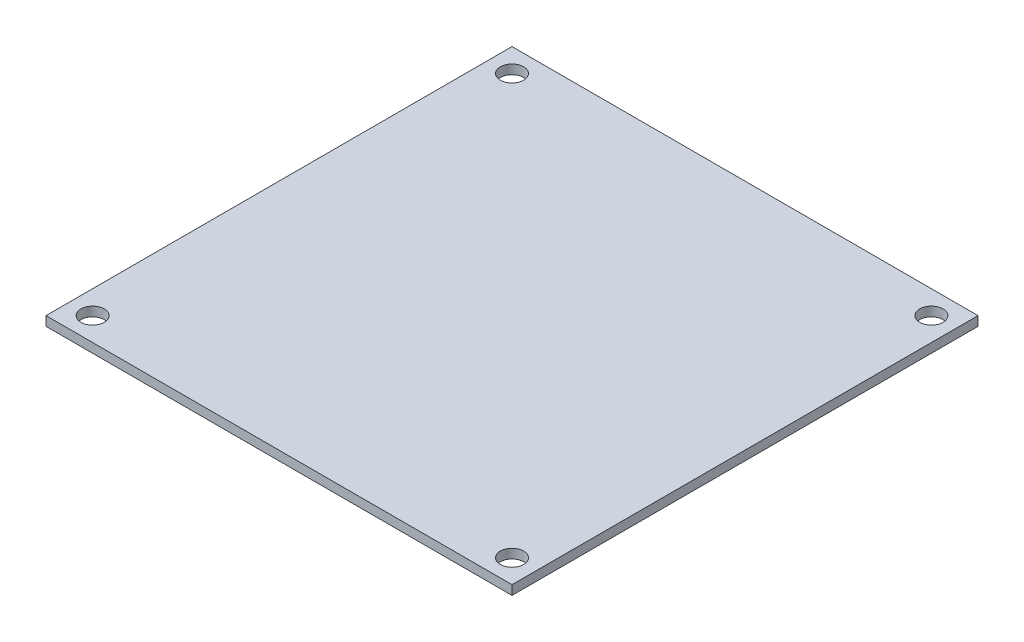
ISO-10303-21;
HEADER;
FILE_DESCRIPTION(('STEP AP214'),'2;1');
FILE_NAME('part.step','',(''),(''),'','','');
FILE_SCHEMA(('AUTOMOTIVE_DESIGN { 1 0 10303 214 1 1 1 1 }'));
ENDSEC;
DATA;
#1=APPLICATION_CONTEXT('core data for automotive mechanical design processes');
#2=APPLICATION_PROTOCOL_DEFINITION('international standard','automotive_design',2000,#1);
#3=PRODUCT_CONTEXT('',#1,'mechanical');
#4=PRODUCT('Part','Part','',(#3));
#5=PRODUCT_RELATED_PRODUCT_CATEGORY('part','',(#4));
#6=PRODUCT_DEFINITION_FORMATION('','',#4);
#7=PRODUCT_DEFINITION_CONTEXT('part definition',#1,'design');
#8=PRODUCT_DEFINITION('design','',#6,#7);
#9=PRODUCT_DEFINITION_SHAPE('','',#8);
#10=(LENGTH_UNIT() NAMED_UNIT(*) SI_UNIT(.MILLI.,.METRE.));
#11=(NAMED_UNIT(*) PLANE_ANGLE_UNIT() SI_UNIT($,.RADIAN.));
#12=(NAMED_UNIT(*) SI_UNIT($,.STERADIAN.) SOLID_ANGLE_UNIT());
#13=UNCERTAINTY_MEASURE_WITH_UNIT(LENGTH_MEASURE(1.E-05),#10,'distance_accuracy_value','');
#14=(GEOMETRIC_REPRESENTATION_CONTEXT(3) GLOBAL_UNCERTAINTY_ASSIGNED_CONTEXT((#13)) GLOBAL_UNIT_ASSIGNED_CONTEXT((#10,
#11,#12)) REPRESENTATION_CONTEXT('',''));
#15=CARTESIAN_POINT('',(0.,0.,0.));
#16=DIRECTION('',(0.,0.,1.));
#17=DIRECTION('',(1.,0.,0.));
#18=AXIS2_PLACEMENT_3D('',#15,#16,#17);
#19=CARTESIAN_POINT('',(-40.,1.6,40.));
#20=DIRECTION('',(0.,1.,0.));
#21=DIRECTION('',(0.,0.,1.));
#22=AXIS2_PLACEMENT_3D('',#19,#20,#21);
#23=PLANE('',#22);
#24=CARTESIAN_POINT('',(36.,1.6,36.));
#25=DIRECTION('',(0.,1.,0.));
#26=DIRECTION('',(0.,0.,1.));
#27=AXIS2_PLACEMENT_3D('',#24,#25,#26);
#28=CIRCLE('',#27,2.);
#29=CARTESIAN_POINT('',(36.,1.6,38.));
#30=VERTEX_POINT('',#29);
#31=EDGE_CURVE('E120',#30,#30,#28,.T.);
#32=ORIENTED_EDGE('',*,*,#31,.F.);
#33=EDGE_LOOP('',(#32));
#34=FACE_BOUND('',#33,.T.);
#35=CARTESIAN_POINT('',(-36.,1.6,-36.));
#36=DIRECTION('',(0.,1.,0.));
#37=DIRECTION('',(0.,0.,1.));
#38=AXIS2_PLACEMENT_3D('',#35,#36,#37);
#39=CIRCLE('',#38,2.);
#40=CARTESIAN_POINT('',(-36.,1.6,-34.));
#41=VERTEX_POINT('',#40);
#42=EDGE_CURVE('E99',#41,#41,#39,.T.);
#43=ORIENTED_EDGE('',*,*,#42,.F.);
#44=EDGE_LOOP('',(#43));
#45=FACE_BOUND('',#44,.T.);
#46=DIRECTION('',(0.,0.,1.));
#47=VECTOR('',#46,1.);
#48=CARTESIAN_POINT('',(-40.,1.6,-40.));
#49=LINE('',#48,#47);
#50=CARTESIAN_POINT('',(-40.,1.6,-40.));
#51=VERTEX_POINT('',#50);
#52=CARTESIAN_POINT('',(-40.,1.6,40.));
#53=VERTEX_POINT('',#52);
#54=EDGE_CURVE('E84',#51,#53,#49,.T.);
#55=ORIENTED_EDGE('',*,*,#54,.T.);
#56=DIRECTION('',(1.,0.,0.));
#57=VECTOR('',#56,1.);
#58=CARTESIAN_POINT('',(-40.,1.6,40.));
#59=LINE('',#58,#57);
#60=CARTESIAN_POINT('',(40.,1.6,40.));
#61=VERTEX_POINT('',#60);
#62=EDGE_CURVE('E79',#53,#61,#59,.T.);
#63=ORIENTED_EDGE('',*,*,#62,.T.);
#64=DIRECTION('',(0.,0.,-1.));
#65=VECTOR('',#64,1.);
#66=CARTESIAN_POINT('',(40.,1.6,-40.));
#67=LINE('',#66,#65);
#68=CARTESIAN_POINT('',(40.,1.6,-40.));
#69=VERTEX_POINT('',#68);
#70=EDGE_CURVE('E82',#61,#69,#67,.T.);
#71=ORIENTED_EDGE('',*,*,#70,.T.);
#72=DIRECTION('',(-1.,0.,0.));
#73=VECTOR('',#72,1.);
#74=CARTESIAN_POINT('',(-40.,1.6,-40.));
#75=LINE('',#74,#73);
#76=EDGE_CURVE('E49',#69,#51,#75,.T.);
#77=ORIENTED_EDGE('',*,*,#76,.T.);
#78=EDGE_LOOP('',(#55,#63,#71,#77));
#79=FACE_BOUND('',#78,.T.);
#80=CARTESIAN_POINT('',(36.,1.6,-36.));
#81=DIRECTION('',(0.,1.,0.));
#82=DIRECTION('',(0.,0.,-1.));
#83=AXIS2_PLACEMENT_3D('',#80,#81,#82);
#84=CIRCLE('',#83,2.);
#85=CARTESIAN_POINT('',(36.,1.6,-38.));
#86=VERTEX_POINT('',#85);
#87=EDGE_CURVE('E114',#86,#86,#84,.T.);
#88=ORIENTED_EDGE('',*,*,#87,.F.);
#89=EDGE_LOOP('',(#88));
#90=FACE_BOUND('',#89,.T.);
#91=CARTESIAN_POINT('',(-36.,1.6,36.));
#92=DIRECTION('',(0.,1.,0.));
#93=DIRECTION('',(0.,0.,-1.));
#94=AXIS2_PLACEMENT_3D('',#91,#92,#93);
#95=CIRCLE('',#94,2.);
#96=CARTESIAN_POINT('',(-36.,1.6,34.));
#97=VERTEX_POINT('',#96);
#98=EDGE_CURVE('E126',#97,#97,#95,.T.);
#99=ORIENTED_EDGE('',*,*,#98,.F.);
#100=EDGE_LOOP('',(#99));
#101=FACE_BOUND('',#100,.T.);
#102=ADVANCED_FACE('F32',(#34,#45,#79,#90,#101),#23,.T.);
#103=CARTESIAN_POINT('',(-40.,0.,40.));
#104=DIRECTION('',(0.,1.,0.));
#105=DIRECTION('',(0.,0.,1.));
#106=AXIS2_PLACEMENT_3D('',#103,#104,#105);
#107=PLANE('',#106);
#108=CARTESIAN_POINT('',(36.,0.,36.));
#109=DIRECTION('',(0.,1.,0.));
#110=DIRECTION('',(0.,0.,1.));
#111=AXIS2_PLACEMENT_3D('',#108,#109,#110);
#112=CIRCLE('',#111,2.);
#113=CARTESIAN_POINT('',(36.,0.,38.));
#114=VERTEX_POINT('',#113);
#115=EDGE_CURVE('E123',#114,#114,#112,.T.);
#116=ORIENTED_EDGE('',*,*,#115,.T.);
#117=EDGE_LOOP('',(#116));
#118=FACE_BOUND('',#117,.T.);
#119=CARTESIAN_POINT('',(-36.,0.,-36.));
#120=DIRECTION('',(0.,1.,0.));
#121=DIRECTION('',(0.,0.,1.));
#122=AXIS2_PLACEMENT_3D('',#119,#120,#121);
#123=CIRCLE('',#122,2.);
#124=CARTESIAN_POINT('',(-36.,0.,-34.));
#125=VERTEX_POINT('',#124);
#126=EDGE_CURVE('E111',#125,#125,#123,.T.);
#127=ORIENTED_EDGE('',*,*,#126,.T.);
#128=EDGE_LOOP('',(#127));
#129=FACE_BOUND('',#128,.T.);
#130=DIRECTION('',(0.,0.,1.));
#131=VECTOR('',#130,1.);
#132=CARTESIAN_POINT('',(-40.,0.,-40.));
#133=LINE('',#132,#131);
#134=CARTESIAN_POINT('',(-40.,0.,-40.));
#135=VERTEX_POINT('',#134);
#136=CARTESIAN_POINT('',(-40.,0.,40.));
#137=VERTEX_POINT('',#136);
#138=EDGE_CURVE('E96',#135,#137,#133,.T.);
#139=ORIENTED_EDGE('',*,*,#138,.F.);
#140=DIRECTION('',(-1.,0.,0.));
#141=VECTOR('',#140,1.);
#142=CARTESIAN_POINT('',(-40.,0.,-40.));
#143=LINE('',#142,#141);
#144=CARTESIAN_POINT('',(40.,0.,-40.));
#145=VERTEX_POINT('',#144);
#146=EDGE_CURVE('E72',#145,#135,#143,.T.);
#147=ORIENTED_EDGE('',*,*,#146,.F.);
#148=DIRECTION('',(0.,0.,-1.));
#149=VECTOR('',#148,1.);
#150=CARTESIAN_POINT('',(40.,0.,-40.));
#151=LINE('',#150,#149);
#152=CARTESIAN_POINT('',(40.,0.,40.));
#153=VERTEX_POINT('',#152);
#154=EDGE_CURVE('E66',#153,#145,#151,.T.);
#155=ORIENTED_EDGE('',*,*,#154,.F.);
#156=DIRECTION('',(1.,0.,0.));
#157=VECTOR('',#156,1.);
#158=CARTESIAN_POINT('',(-40.,0.,40.));
#159=LINE('',#158,#157);
#160=EDGE_CURVE('E88',#137,#153,#159,.T.);
#161=ORIENTED_EDGE('',*,*,#160,.F.);
#162=EDGE_LOOP('',(#139,#147,#155,#161));
#163=FACE_BOUND('',#162,.T.);
#164=CARTESIAN_POINT('',(36.,0.,-36.));
#165=DIRECTION('',(0.,1.,0.));
#166=DIRECTION('',(0.,0.,-1.));
#167=AXIS2_PLACEMENT_3D('',#164,#165,#166);
#168=CIRCLE('',#167,2.);
#169=CARTESIAN_POINT('',(36.,0.,-38.));
#170=VERTEX_POINT('',#169);
#171=EDGE_CURVE('E117',#170,#170,#168,.T.);
#172=ORIENTED_EDGE('',*,*,#171,.T.);
#173=EDGE_LOOP('',(#172));
#174=FACE_BOUND('',#173,.T.);
#175=CARTESIAN_POINT('',(-36.,0.,36.));
#176=DIRECTION('',(0.,1.,0.));
#177=DIRECTION('',(0.,0.,-1.));
#178=AXIS2_PLACEMENT_3D('',#175,#176,#177);
#179=CIRCLE('',#178,2.);
#180=CARTESIAN_POINT('',(-36.,0.,34.));
#181=VERTEX_POINT('',#180);
#182=EDGE_CURVE('E129',#181,#181,#179,.T.);
#183=ORIENTED_EDGE('',*,*,#182,.T.);
#184=EDGE_LOOP('',(#183));
#185=FACE_BOUND('',#184,.T.);
#186=ADVANCED_FACE('F107',(#118,#129,#163,#174,#185),#107,.F.);
#187=CARTESIAN_POINT('',(-40.,1.6,-40.));
#188=DIRECTION('',(1.,0.,0.));
#189=DIRECTION('',(0.,0.,-1.));
#190=AXIS2_PLACEMENT_3D('',#187,#188,#189);
#191=PLANE('',#190);
#192=ORIENTED_EDGE('',*,*,#138,.T.);
#193=DIRECTION('',(0.,-1.,0.));
#194=VECTOR('',#193,1.);
#195=CARTESIAN_POINT('',(-40.,1.6,40.));
#196=LINE('',#195,#194);
#197=EDGE_CURVE('E11',#53,#137,#196,.T.);
#198=ORIENTED_EDGE('',*,*,#197,.F.);
#199=ORIENTED_EDGE('',*,*,#54,.F.);
#200=DIRECTION('',(0.,-1.,0.));
#201=VECTOR('',#200,1.);
#202=CARTESIAN_POINT('',(-40.,1.6,-40.));
#203=LINE('',#202,#201);
#204=EDGE_CURVE('E92',#51,#135,#203,.T.);
#205=ORIENTED_EDGE('',*,*,#204,.T.);
#206=EDGE_LOOP('',(#192,#198,#199,#205));
#207=FACE_BOUND('',#206,.T.);
#208=ADVANCED_FACE('F34',(#207),#191,.F.);
#209=CARTESIAN_POINT('',(-40.,1.6,40.));
#210=DIRECTION('',(0.,0.,-1.));
#211=DIRECTION('',(-1.,0.,0.));
#212=AXIS2_PLACEMENT_3D('',#209,#210,#211);
#213=PLANE('',#212);
#214=ORIENTED_EDGE('',*,*,#160,.T.);
#215=DIRECTION('',(0.,-1.,0.));
#216=VECTOR('',#215,1.);
#217=CARTESIAN_POINT('',(40.,1.6,40.));
#218=LINE('',#217,#216);
#219=EDGE_CURVE('E41',#61,#153,#218,.T.);
#220=ORIENTED_EDGE('',*,*,#219,.F.);
#221=ORIENTED_EDGE('',*,*,#62,.F.);
#222=ORIENTED_EDGE('',*,*,#197,.T.);
#223=EDGE_LOOP('',(#214,#220,#221,#222));
#224=FACE_BOUND('',#223,.T.);
#225=ADVANCED_FACE('F87',(#224),#213,.F.);
#226=CARTESIAN_POINT('',(40.,1.6,-40.));
#227=DIRECTION('',(-1.,0.,0.));
#228=DIRECTION('',(0.,0.,1.));
#229=AXIS2_PLACEMENT_3D('',#226,#227,#228);
#230=PLANE('',#229);
#231=ORIENTED_EDGE('',*,*,#154,.T.);
#232=DIRECTION('',(0.,-1.,0.));
#233=VECTOR('',#232,1.);
#234=CARTESIAN_POINT('',(40.,1.6,-40.));
#235=LINE('',#234,#233);
#236=EDGE_CURVE('E89',#69,#145,#235,.T.);
#237=ORIENTED_EDGE('',*,*,#236,.F.);
#238=ORIENTED_EDGE('',*,*,#70,.F.);
#239=ORIENTED_EDGE('',*,*,#219,.T.);
#240=EDGE_LOOP('',(#231,#237,#238,#239));
#241=FACE_BOUND('',#240,.T.);
#242=ADVANCED_FACE('F90',(#241),#230,.F.);
#243=CARTESIAN_POINT('',(-40.,1.6,-40.));
#244=DIRECTION('',(0.,0.,1.));
#245=DIRECTION('',(1.,0.,0.));
#246=AXIS2_PLACEMENT_3D('',#243,#244,#245);
#247=PLANE('',#246);
#248=ORIENTED_EDGE('',*,*,#146,.T.);
#249=ORIENTED_EDGE('',*,*,#204,.F.);
#250=ORIENTED_EDGE('',*,*,#76,.F.);
#251=ORIENTED_EDGE('',*,*,#236,.T.);
#252=EDGE_LOOP('',(#248,#249,#250,#251));
#253=FACE_BOUND('',#252,.T.);
#254=ADVANCED_FACE('F104',(#253),#247,.F.);
#255=CARTESIAN_POINT('',(-36.,1.6,-36.));
#256=DIRECTION('',(0.,-1.,0.));
#257=DIRECTION('',(0.,0.,-1.));
#258=AXIS2_PLACEMENT_3D('',#255,#256,#257);
#259=CYLINDRICAL_SURFACE('',#258,2.);
#260=ORIENTED_EDGE('',*,*,#42,.T.);
#261=EDGE_LOOP('',(#260));
#262=FACE_BOUND('',#261,.T.);
#263=ORIENTED_EDGE('',*,*,#126,.F.);
#264=EDGE_LOOP('',(#263));
#265=FACE_BOUND('',#264,.T.);
#266=ADVANCED_FACE('F149',(#262,#265),#259,.F.);
#267=CARTESIAN_POINT('',(36.,1.6,-36.));
#268=DIRECTION('',(0.,-1.,0.));
#269=DIRECTION('',(0.,0.,-1.));
#270=AXIS2_PLACEMENT_3D('',#267,#268,#269);
#271=CYLINDRICAL_SURFACE('',#270,2.);
#272=ORIENTED_EDGE('',*,*,#87,.T.);
#273=EDGE_LOOP('',(#272));
#274=FACE_BOUND('',#273,.T.);
#275=ORIENTED_EDGE('',*,*,#171,.F.);
#276=EDGE_LOOP('',(#275));
#277=FACE_BOUND('',#276,.T.);
#278=ADVANCED_FACE('F195',(#274,#277),#271,.F.);
#279=CARTESIAN_POINT('',(36.,1.6,36.));
#280=DIRECTION('',(0.,-1.,0.));
#281=DIRECTION('',(0.,0.,-1.));
#282=AXIS2_PLACEMENT_3D('',#279,#280,#281);
#283=CYLINDRICAL_SURFACE('',#282,2.);
#284=ORIENTED_EDGE('',*,*,#31,.T.);
#285=EDGE_LOOP('',(#284));
#286=FACE_BOUND('',#285,.T.);
#287=ORIENTED_EDGE('',*,*,#115,.F.);
#288=EDGE_LOOP('',(#287));
#289=FACE_BOUND('',#288,.T.);
#290=ADVANCED_FACE('F203',(#286,#289),#283,.F.);
#291=CARTESIAN_POINT('',(-36.,1.6,36.));
#292=DIRECTION('',(0.,-1.,0.));
#293=DIRECTION('',(0.,0.,-1.));
#294=AXIS2_PLACEMENT_3D('',#291,#292,#293);
#295=CYLINDRICAL_SURFACE('',#294,2.);
#296=ORIENTED_EDGE('',*,*,#98,.T.);
#297=EDGE_LOOP('',(#296));
#298=FACE_BOUND('',#297,.T.);
#299=ORIENTED_EDGE('',*,*,#182,.F.);
#300=EDGE_LOOP('',(#299));
#301=FACE_BOUND('',#300,.T.);
#302=ADVANCED_FACE('F135',(#298,#301),#295,.F.);
#303=CLOSED_SHELL('',(#102,#186,#208,#225,#242,#254,#266,#278,#290,#302));
#304=MANIFOLD_SOLID_BREP('B2',#303);
#305=ADVANCED_BREP_SHAPE_REPRESENTATION('',(#18,#304),#14);
#306=SHAPE_DEFINITION_REPRESENTATION(#9,#305);
ENDSEC;
END-ISO-10303-21;
